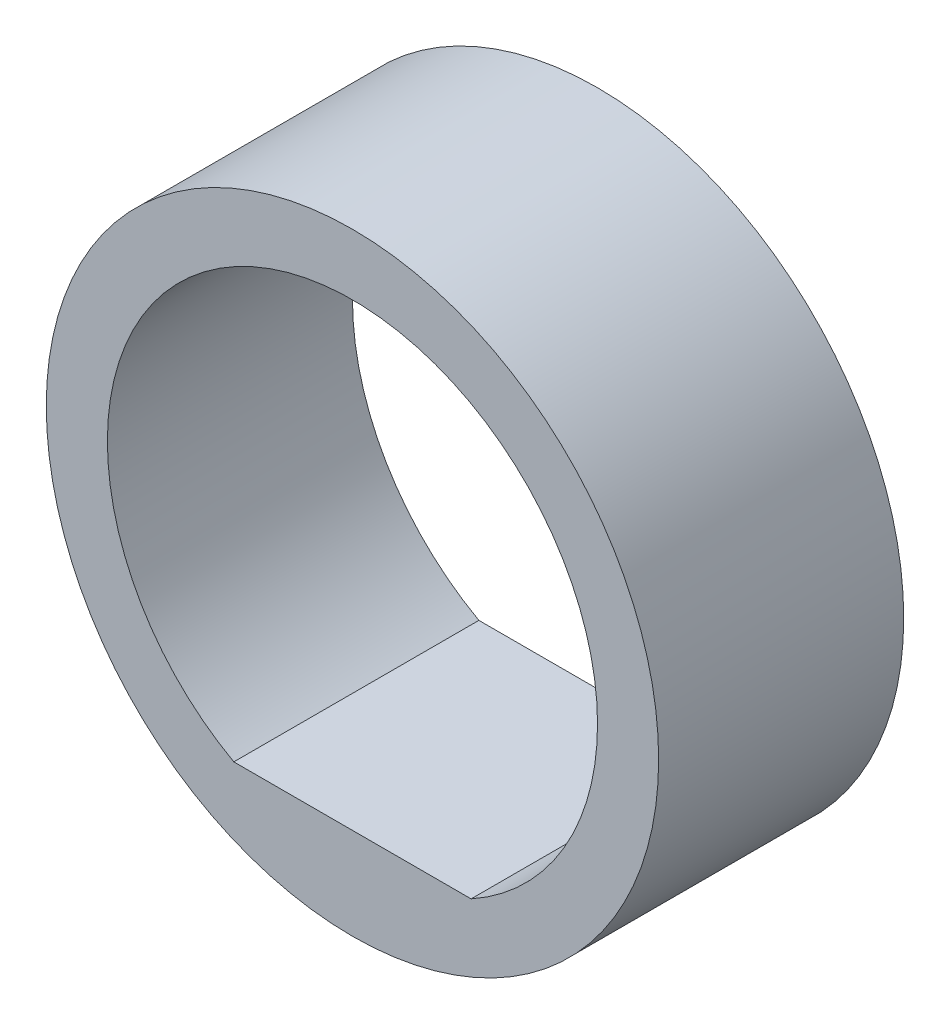
ISO-10303-21;
HEADER;
FILE_DESCRIPTION(('STEP AP214'),'2;1');
FILE_NAME('part.step','',(''),(''),'','','');
FILE_SCHEMA(('AUTOMOTIVE_DESIGN { 1 0 10303 214 1 1 1 1 }'));
ENDSEC;
DATA;
#1=APPLICATION_CONTEXT('core data for automotive mechanical design processes');
#2=APPLICATION_PROTOCOL_DEFINITION('international standard','automotive_design',2000,#1);
#3=PRODUCT_CONTEXT('',#1,'mechanical');
#4=PRODUCT('Part','Part','',(#3));
#5=PRODUCT_RELATED_PRODUCT_CATEGORY('part','',(#4));
#6=PRODUCT_DEFINITION_FORMATION('','',#4);
#7=PRODUCT_DEFINITION_CONTEXT('part definition',#1,'design');
#8=PRODUCT_DEFINITION('design','',#6,#7);
#9=PRODUCT_DEFINITION_SHAPE('','',#8);
#10=(LENGTH_UNIT() NAMED_UNIT(*) SI_UNIT(.MILLI.,.METRE.));
#11=(NAMED_UNIT(*) PLANE_ANGLE_UNIT() SI_UNIT($,.RADIAN.));
#12=(NAMED_UNIT(*) SI_UNIT($,.STERADIAN.) SOLID_ANGLE_UNIT());
#13=UNCERTAINTY_MEASURE_WITH_UNIT(LENGTH_MEASURE(1.E-05),#10,'distance_accuracy_value','');
#14=(GEOMETRIC_REPRESENTATION_CONTEXT(3) GLOBAL_UNCERTAINTY_ASSIGNED_CONTEXT((#13)) GLOBAL_UNIT_ASSIGNED_CONTEXT((#10,
#11,#12)) REPRESENTATION_CONTEXT('',''));
#15=CARTESIAN_POINT('',(0.,0.,0.));
#16=DIRECTION('',(0.,0.,1.));
#17=DIRECTION('',(1.,0.,0.));
#18=AXIS2_PLACEMENT_3D('',#15,#16,#17);
#19=CARTESIAN_POINT('',(-111.133978707819,0.,4.));
#20=DIRECTION('',(0.,0.,1.));
#21=DIRECTION('',(1.,0.,0.));
#22=AXIS2_PLACEMENT_3D('',#19,#20,#21);
#23=PLANE('',#22);
#24=CARTESIAN_POINT('',(-111.133978707819,0.,4.));
#25=DIRECTION('',(0.,0.,1.));
#26=DIRECTION('',(1.,0.,0.));
#27=AXIS2_PLACEMENT_3D('',#24,#25,#26);
#28=CIRCLE('',#27,4.99750000000001);
#29=CARTESIAN_POINT('',(-106.136478707819,0.,4.));
#30=VERTEX_POINT('',#29);
#31=EDGE_CURVE('E11',#30,#30,#28,.T.);
#32=ORIENTED_EDGE('',*,*,#31,.T.);
#33=EDGE_LOOP('',(#32));
#34=FACE_BOUND('',#33,.T.);
#35=DIRECTION('',(1.,0.,0.));
#36=VECTOR('',#35,1.);
#37=CARTESIAN_POINT('',(-111.133978707819,-3.5,4.));
#38=LINE('',#37,#36);
#39=CARTESIAN_POINT('',(-113.070470380923,-3.5,4.));
#40=VERTEX_POINT('',#39);
#41=CARTESIAN_POINT('',(-109.197487034716,-3.5,4.));
#42=VERTEX_POINT('',#41);
#43=EDGE_CURVE('E73',#40,#42,#38,.T.);
#44=ORIENTED_EDGE('',*,*,#43,.F.);
#45=CARTESIAN_POINT('',(-111.133978707819,0.,4.));
#46=DIRECTION('',(0.,0.,1.));
#47=DIRECTION('',(1.,0.,0.));
#48=AXIS2_PLACEMENT_3D('',#45,#46,#47);
#49=CIRCLE('',#48,4.00000000000001);
#50=EDGE_CURVE('E67',#42,#40,#49,.T.);
#51=ORIENTED_EDGE('',*,*,#50,.F.);
#52=EDGE_LOOP('',(#44,#51));
#53=FACE_BOUND('',#52,.T.);
#54=ADVANCED_FACE('F36',(#34,#53),#23,.T.);
#55=CARTESIAN_POINT('',(-111.133978707819,0.,0.));
#56=DIRECTION('',(0.,0.,1.));
#57=DIRECTION('',(1.,0.,0.));
#58=AXIS2_PLACEMENT_3D('',#55,#56,#57);
#59=PLANE('',#58);
#60=CARTESIAN_POINT('',(-111.133978707819,0.,0.));
#61=DIRECTION('',(0.,0.,1.));
#62=DIRECTION('',(1.,0.,0.));
#63=AXIS2_PLACEMENT_3D('',#60,#61,#62);
#64=CIRCLE('',#63,4.99750000000001);
#65=CARTESIAN_POINT('',(-106.136478707819,0.,0.));
#66=VERTEX_POINT('',#65);
#67=EDGE_CURVE('E40',#66,#66,#64,.T.);
#68=ORIENTED_EDGE('',*,*,#67,.F.);
#69=EDGE_LOOP('',(#68));
#70=FACE_BOUND('',#69,.T.);
#71=CARTESIAN_POINT('',(-111.133978707819,0.,0.));
#72=DIRECTION('',(0.,0.,1.));
#73=DIRECTION('',(1.,0.,0.));
#74=AXIS2_PLACEMENT_3D('',#71,#72,#73);
#75=CIRCLE('',#74,4.00000000000001);
#76=CARTESIAN_POINT('',(-109.197487034716,-3.5,0.));
#77=VERTEX_POINT('',#76);
#78=CARTESIAN_POINT('',(-113.070470380923,-3.5,0.));
#79=VERTEX_POINT('',#78);
#80=EDGE_CURVE('E64',#77,#79,#75,.T.);
#81=ORIENTED_EDGE('',*,*,#80,.T.);
#82=DIRECTION('',(1.,0.,0.));
#83=VECTOR('',#82,1.);
#84=CARTESIAN_POINT('',(-111.133978707819,-3.5,0.));
#85=LINE('',#84,#83);
#86=EDGE_CURVE('E70',#79,#77,#85,.T.);
#87=ORIENTED_EDGE('',*,*,#86,.T.);
#88=EDGE_LOOP('',(#81,#87));
#89=FACE_BOUND('',#88,.T.);
#90=ADVANCED_FACE('F75',(#70,#89),#59,.F.);
#91=CARTESIAN_POINT('',(-111.133978707819,0.,4.));
#92=DIRECTION('',(0.,0.,-1.));
#93=DIRECTION('',(-1.,0.,0.));
#94=AXIS2_PLACEMENT_3D('',#91,#92,#93);
#95=CYLINDRICAL_SURFACE('',#94,4.99750000000001);
#96=ORIENTED_EDGE('',*,*,#31,.F.);
#97=EDGE_LOOP('',(#96));
#98=FACE_BOUND('',#97,.T.);
#99=ORIENTED_EDGE('',*,*,#67,.T.);
#100=EDGE_LOOP('',(#99));
#101=FACE_BOUND('',#100,.T.);
#102=ADVANCED_FACE('F38',(#98,#101),#95,.T.);
#103=CARTESIAN_POINT('',(-111.133978707819,0.,4.));
#104=DIRECTION('',(0.,0.,-1.));
#105=DIRECTION('',(-1.,0.,0.));
#106=AXIS2_PLACEMENT_3D('',#103,#104,#105);
#107=CYLINDRICAL_SURFACE('',#106,4.00000000000001);
#108=ORIENTED_EDGE('',*,*,#80,.F.);
#109=DIRECTION('',(0.,0.,-1.));
#110=VECTOR('',#109,1.);
#111=CARTESIAN_POINT('',(-109.197487034716,-3.5,4.));
#112=LINE('',#111,#110);
#113=EDGE_CURVE('E56',#42,#77,#112,.T.);
#114=ORIENTED_EDGE('',*,*,#113,.F.);
#115=ORIENTED_EDGE('',*,*,#50,.T.);
#116=DIRECTION('',(0.,0.,-1.));
#117=VECTOR('',#116,1.);
#118=CARTESIAN_POINT('',(-113.070470380923,-3.5,4.));
#119=LINE('',#118,#117);
#120=EDGE_CURVE('E51',#40,#79,#119,.T.);
#121=ORIENTED_EDGE('',*,*,#120,.T.);
#122=EDGE_LOOP('',(#108,#114,#115,#121));
#123=FACE_BOUND('',#122,.T.);
#124=ADVANCED_FACE('F62',(#123),#107,.F.);
#125=CARTESIAN_POINT('',(-111.133978707819,-3.5,4.));
#126=DIRECTION('',(0.,1.,0.));
#127=DIRECTION('',(0.,0.,1.));
#128=AXIS2_PLACEMENT_3D('',#125,#126,#127);
#129=PLANE('',#128);
#130=ORIENTED_EDGE('',*,*,#86,.F.);
#131=ORIENTED_EDGE('',*,*,#120,.F.);
#132=ORIENTED_EDGE('',*,*,#43,.T.);
#133=ORIENTED_EDGE('',*,*,#113,.T.);
#134=EDGE_LOOP('',(#130,#131,#132,#133));
#135=FACE_BOUND('',#134,.T.);
#136=ADVANCED_FACE('F71',(#135),#129,.T.);
#137=CLOSED_SHELL('',(#54,#90,#102,#124,#136));
#138=MANIFOLD_SOLID_BREP('B2',#137);
#139=ADVANCED_BREP_SHAPE_REPRESENTATION('',(#18,#138),#14);
#140=SHAPE_DEFINITION_REPRESENTATION(#9,#139);
ENDSEC;
END-ISO-10303-21;
